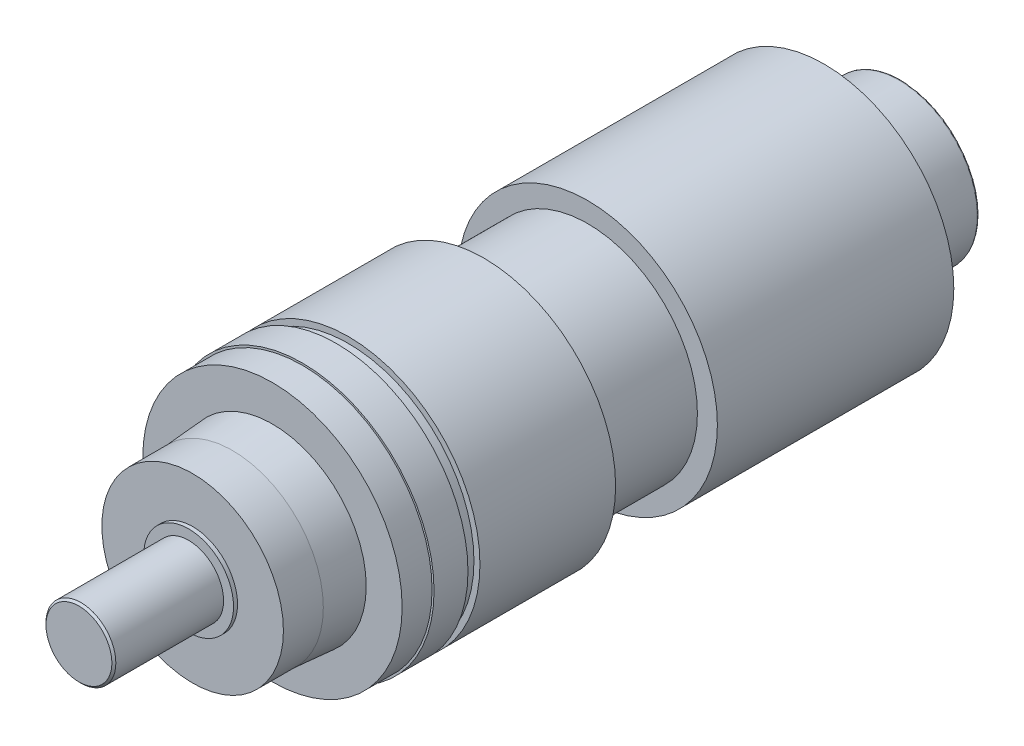
ISO-10303-21;
HEADER;
FILE_DESCRIPTION(('STEP AP214'),'2;1');
FILE_NAME('part.step','',(''),(''),'','','');
FILE_SCHEMA(('AUTOMOTIVE_DESIGN { 1 0 10303 214 1 1 1 1 }'));
ENDSEC;
DATA;
#1=APPLICATION_CONTEXT('core data for automotive mechanical design processes');
#2=APPLICATION_PROTOCOL_DEFINITION('international standard','automotive_design',2000,#1);
#3=PRODUCT_CONTEXT('',#1,'mechanical');
#4=PRODUCT('Part','Part','',(#3));
#5=PRODUCT_RELATED_PRODUCT_CATEGORY('part','',(#4));
#6=PRODUCT_DEFINITION_FORMATION('','',#4);
#7=PRODUCT_DEFINITION_CONTEXT('part definition',#1,'design');
#8=PRODUCT_DEFINITION('design','',#6,#7);
#9=PRODUCT_DEFINITION_SHAPE('','',#8);
#10=(LENGTH_UNIT() NAMED_UNIT(*) SI_UNIT(.MILLI.,.METRE.));
#11=(NAMED_UNIT(*) PLANE_ANGLE_UNIT() SI_UNIT($,.RADIAN.));
#12=(NAMED_UNIT(*) SI_UNIT($,.STERADIAN.) SOLID_ANGLE_UNIT());
#13=UNCERTAINTY_MEASURE_WITH_UNIT(LENGTH_MEASURE(1.E-05),#10,'distance_accuracy_value','');
#14=(GEOMETRIC_REPRESENTATION_CONTEXT(3) GLOBAL_UNCERTAINTY_ASSIGNED_CONTEXT((#13)) GLOBAL_UNIT_ASSIGNED_CONTEXT((#10,
#11,#12)) REPRESENTATION_CONTEXT('',''));
#15=CARTESIAN_POINT('',(0.,0.,0.));
#16=DIRECTION('',(0.,0.,1.));
#17=DIRECTION('',(1.,0.,0.));
#18=AXIS2_PLACEMENT_3D('',#15,#16,#17);
#19=CARTESIAN_POINT('',(0.,40.0334954681413,-331.5));
#20=DIRECTION('',(0.,0.,1.));
#21=DIRECTION('',(1.,0.,0.));
#22=AXIS2_PLACEMENT_3D('',#19,#20,#21);
#23=PLANE('',#22);
#24=CARTESIAN_POINT('',(0.,0.,-331.5));
#25=DIRECTION('',(0.,0.,1.));
#26=DIRECTION('',(1.,0.,0.));
#27=AXIS2_PLACEMENT_3D('',#24,#25,#26);
#28=CIRCLE('',#27,42.5000000000001);
#29=CARTESIAN_POINT('',(42.5000000000001,0.,-331.5));
#30=VERTEX_POINT('',#29);
#31=EDGE_CURVE('E50',#30,#30,#28,.T.);
#32=ORIENTED_EDGE('',*,*,#31,.F.);
#33=EDGE_LOOP('',(#32));
#34=FACE_BOUND('',#33,.T.);
#35=CARTESIAN_POINT('',(0.,0.,-331.5));
#36=DIRECTION('',(0.,0.,1.));
#37=DIRECTION('',(1.,0.,0.));
#38=AXIS2_PLACEMENT_3D('',#35,#36,#37);
#39=CIRCLE('',#38,40.0334954681413);
#40=CARTESIAN_POINT('',(40.0334954681413,0.,-331.5));
#41=VERTEX_POINT('',#40);
#42=EDGE_CURVE('E113',#41,#41,#39,.T.);
#43=ORIENTED_EDGE('',*,*,#42,.T.);
#44=EDGE_LOOP('',(#43));
#45=FACE_BOUND('',#44,.T.);
#46=ADVANCED_FACE('F30',(#34,#45),#23,.F.);
#47=CARTESIAN_POINT('',(0.,0.,61.7080027707133));
#48=DIRECTION('',(0.,0.,1.));
#49=DIRECTION('',(1.,0.,0.));
#50=AXIS2_PLACEMENT_3D('',#47,#48,#49);
#51=CYLINDRICAL_SURFACE('',#50,42.5000000000001);
#52=CARTESIAN_POINT('',(0.,0.,-318.5));
#53=DIRECTION('',(0.,0.,1.));
#54=DIRECTION('',(1.,0.,0.));
#55=AXIS2_PLACEMENT_3D('',#52,#53,#54);
#56=CIRCLE('',#55,42.5000000000001);
#57=CARTESIAN_POINT('',(42.5000000000001,0.,-318.5));
#58=VERTEX_POINT('',#57);
#59=EDGE_CURVE('E53',#58,#58,#56,.T.);
#60=ORIENTED_EDGE('',*,*,#59,.F.);
#61=EDGE_LOOP('',(#60));
#62=FACE_BOUND('',#61,.T.);
#63=ORIENTED_EDGE('',*,*,#31,.T.);
#64=EDGE_LOOP('',(#63));
#65=FACE_BOUND('',#64,.T.);
#66=ADVANCED_FACE('F133',(#62,#65),#51,.T.);
#67=CARTESIAN_POINT('',(0.,65.0000000000001,-318.5));
#68=DIRECTION('',(0.,0.,1.));
#69=DIRECTION('',(1.,0.,0.));
#70=AXIS2_PLACEMENT_3D('',#67,#68,#69);
#71=PLANE('',#70);
#72=CARTESIAN_POINT('',(0.,0.,-318.5));
#73=DIRECTION('',(0.,0.,1.));
#74=DIRECTION('',(1.,0.,0.));
#75=AXIS2_PLACEMENT_3D('',#72,#73,#74);
#76=CIRCLE('',#75,65.0000000000001);
#77=CARTESIAN_POINT('',(65.0000000000001,0.,-318.5));
#78=VERTEX_POINT('',#77);
#79=EDGE_CURVE('E56',#78,#78,#76,.T.);
#80=ORIENTED_EDGE('',*,*,#79,.F.);
#81=EDGE_LOOP('',(#80));
#82=FACE_BOUND('',#81,.T.);
#83=ORIENTED_EDGE('',*,*,#59,.T.);
#84=EDGE_LOOP('',(#83));
#85=FACE_BOUND('',#84,.T.);
#86=ADVANCED_FACE('F139',(#82,#85),#71,.F.);
#87=CARTESIAN_POINT('',(0.,0.,61.7080027707133));
#88=DIRECTION('',(0.,0.,1.));
#89=DIRECTION('',(1.,0.,0.));
#90=AXIS2_PLACEMENT_3D('',#87,#88,#89);
#91=CYLINDRICAL_SURFACE('',#90,65.0000000000001);
#92=CARTESIAN_POINT('',(0.,0.,-200.002907483874));
#93=DIRECTION('',(0.,0.,1.));
#94=DIRECTION('',(1.,0.,0.));
#95=AXIS2_PLACEMENT_3D('',#92,#93,#94);
#96=CIRCLE('',#95,65.0000000000001);
#97=CARTESIAN_POINT('',(65.0000000000001,0.,-200.002907483874));
#98=VERTEX_POINT('',#97);
#99=EDGE_CURVE('E59',#98,#98,#96,.T.);
#100=ORIENTED_EDGE('',*,*,#99,.F.);
#101=EDGE_LOOP('',(#100));
#102=FACE_BOUND('',#101,.T.);
#103=ORIENTED_EDGE('',*,*,#79,.T.);
#104=EDGE_LOOP('',(#103));
#105=FACE_BOUND('',#104,.T.);
#106=ADVANCED_FACE('F146',(#102,#105),#91,.T.);
#107=CARTESIAN_POINT('',(0.,65.0000000000001,-200.002907483874));
#108=DIRECTION('',(0.,0.,-1.));
#109=DIRECTION('',(-1.,0.,0.));
#110=AXIS2_PLACEMENT_3D('',#107,#108,#109);
#111=PLANE('',#110);
#112=CARTESIAN_POINT('',(0.,0.,-200.002907483874));
#113=DIRECTION('',(0.,0.,1.));
#114=DIRECTION('',(1.,0.,0.));
#115=AXIS2_PLACEMENT_3D('',#112,#113,#114);
#116=CIRCLE('',#115,55.0000000000001);
#117=CARTESIAN_POINT('',(55.0000000000001,0.,-200.002907483874));
#118=VERTEX_POINT('',#117);
#119=EDGE_CURVE('E62',#118,#118,#116,.T.);
#120=ORIENTED_EDGE('',*,*,#119,.F.);
#121=EDGE_LOOP('',(#120));
#122=FACE_BOUND('',#121,.T.);
#123=ORIENTED_EDGE('',*,*,#99,.T.);
#124=EDGE_LOOP('',(#123));
#125=FACE_BOUND('',#124,.T.);
#126=ADVANCED_FACE('F150',(#122,#125),#111,.F.);
#127=CARTESIAN_POINT('',(0.,0.,61.7080027707133));
#128=DIRECTION('',(0.,0.,1.));
#129=DIRECTION('',(1.,0.,0.));
#130=AXIS2_PLACEMENT_3D('',#127,#128,#129);
#131=CYLINDRICAL_SURFACE('',#130,55.0000000000001);
#132=CARTESIAN_POINT('',(0.,0.,-148.));
#133=DIRECTION('',(0.,0.,1.));
#134=DIRECTION('',(1.,0.,0.));
#135=AXIS2_PLACEMENT_3D('',#132,#133,#134);
#136=CIRCLE('',#135,55.0000000000001);
#137=CARTESIAN_POINT('',(55.0000000000001,0.,-148.));
#138=VERTEX_POINT('',#137);
#139=EDGE_CURVE('E65',#138,#138,#136,.T.);
#140=ORIENTED_EDGE('',*,*,#139,.F.);
#141=EDGE_LOOP('',(#140));
#142=FACE_BOUND('',#141,.T.);
#143=ORIENTED_EDGE('',*,*,#119,.T.);
#144=EDGE_LOOP('',(#143));
#145=FACE_BOUND('',#144,.T.);
#146=ADVANCED_FACE('F154',(#142,#145),#131,.T.);
#147=CARTESIAN_POINT('',(0.,55.0000000000001,-148.));
#148=DIRECTION('',(0.,0.,1.));
#149=DIRECTION('',(1.,0.,0.));
#150=AXIS2_PLACEMENT_3D('',#147,#148,#149);
#151=PLANE('',#150);
#152=CARTESIAN_POINT('',(0.,0.,-148.));
#153=DIRECTION('',(0.,0.,1.));
#154=DIRECTION('',(1.,0.,0.));
#155=AXIS2_PLACEMENT_3D('',#152,#153,#154);
#156=CIRCLE('',#155,66.);
#157=CARTESIAN_POINT('',(66.,0.,-148.));
#158=VERTEX_POINT('',#157);
#159=EDGE_CURVE('E68',#158,#158,#156,.T.);
#160=ORIENTED_EDGE('',*,*,#159,.F.);
#161=EDGE_LOOP('',(#160));
#162=FACE_BOUND('',#161,.T.);
#163=ORIENTED_EDGE('',*,*,#139,.T.);
#164=EDGE_LOOP('',(#163));
#165=FACE_BOUND('',#164,.T.);
#166=ADVANCED_FACE('F158',(#162,#165),#151,.F.);
#167=CARTESIAN_POINT('',(0.,0.,61.7080027707133));
#168=DIRECTION('',(0.,0.,1.));
#169=DIRECTION('',(1.,0.,0.));
#170=AXIS2_PLACEMENT_3D('',#167,#168,#169);
#171=CYLINDRICAL_SURFACE('',#170,66.);
#172=CARTESIAN_POINT('',(0.,0.,-80.));
#173=DIRECTION('',(0.,0.,1.));
#174=DIRECTION('',(1.,0.,0.));
#175=AXIS2_PLACEMENT_3D('',#172,#173,#174);
#176=CIRCLE('',#175,66.);
#177=CARTESIAN_POINT('',(66.,0.,-80.));
#178=VERTEX_POINT('',#177);
#179=EDGE_CURVE('E71',#178,#178,#176,.T.);
#180=ORIENTED_EDGE('',*,*,#179,.F.);
#181=EDGE_LOOP('',(#180));
#182=FACE_BOUND('',#181,.T.);
#183=ORIENTED_EDGE('',*,*,#159,.T.);
#184=EDGE_LOOP('',(#183));
#185=FACE_BOUND('',#184,.T.);
#186=ADVANCED_FACE('F162',(#182,#185),#171,.T.);
#187=CARTESIAN_POINT('',(0.,66.,-80.));
#188=DIRECTION('',(0.,0.,-1.));
#189=DIRECTION('',(-1.,0.,0.));
#190=AXIS2_PLACEMENT_3D('',#187,#188,#189);
#191=PLANE('',#190);
#192=CARTESIAN_POINT('',(0.,0.,-80.));
#193=DIRECTION('',(0.,0.,1.));
#194=DIRECTION('',(1.,0.,0.));
#195=AXIS2_PLACEMENT_3D('',#192,#193,#194);
#196=CIRCLE('',#195,63.);
#197=CARTESIAN_POINT('',(63.,0.,-80.));
#198=VERTEX_POINT('',#197);
#199=EDGE_CURVE('E74',#198,#198,#196,.T.);
#200=ORIENTED_EDGE('',*,*,#199,.F.);
#201=EDGE_LOOP('',(#200));
#202=FACE_BOUND('',#201,.T.);
#203=ORIENTED_EDGE('',*,*,#179,.T.);
#204=EDGE_LOOP('',(#203));
#205=FACE_BOUND('',#204,.T.);
#206=ADVANCED_FACE('F166',(#202,#205),#191,.F.);
#207=CARTESIAN_POINT('',(0.,0.,61.7080027707133));
#208=DIRECTION('',(0.,0.,1.));
#209=DIRECTION('',(1.,0.,0.));
#210=AXIS2_PLACEMENT_3D('',#207,#208,#209);
#211=CYLINDRICAL_SURFACE('',#210,63.);
#212=CARTESIAN_POINT('',(0.,0.,-74.));
#213=DIRECTION('',(0.,0.,1.));
#214=DIRECTION('',(1.,0.,0.));
#215=AXIS2_PLACEMENT_3D('',#212,#213,#214);
#216=CIRCLE('',#215,63.);
#217=CARTESIAN_POINT('',(63.,0.,-74.));
#218=VERTEX_POINT('',#217);
#219=EDGE_CURVE('E77',#218,#218,#216,.T.);
#220=ORIENTED_EDGE('',*,*,#219,.F.);
#221=EDGE_LOOP('',(#220));
#222=FACE_BOUND('',#221,.T.);
#223=ORIENTED_EDGE('',*,*,#199,.T.);
#224=EDGE_LOOP('',(#223));
#225=FACE_BOUND('',#224,.T.);
#226=ADVANCED_FACE('F170',(#222,#225),#211,.T.);
#227=CARTESIAN_POINT('',(0.,63.,-74.));
#228=DIRECTION('',(0.,0.,1.));
#229=DIRECTION('',(1.,0.,0.));
#230=AXIS2_PLACEMENT_3D('',#227,#228,#229);
#231=PLANE('',#230);
#232=CARTESIAN_POINT('',(0.,0.,-74.));
#233=DIRECTION('',(0.,0.,1.));
#234=DIRECTION('',(1.,0.,0.));
#235=AXIS2_PLACEMENT_3D('',#232,#233,#234);
#236=CIRCLE('',#235,66.);
#237=CARTESIAN_POINT('',(66.,0.,-74.));
#238=VERTEX_POINT('',#237);
#239=EDGE_CURVE('E80',#238,#238,#236,.T.);
#240=ORIENTED_EDGE('',*,*,#239,.F.);
#241=EDGE_LOOP('',(#240));
#242=FACE_BOUND('',#241,.T.);
#243=ORIENTED_EDGE('',*,*,#219,.T.);
#244=EDGE_LOOP('',(#243));
#245=FACE_BOUND('',#244,.T.);
#246=ADVANCED_FACE('F174',(#242,#245),#231,.F.);
#247=CARTESIAN_POINT('',(0.,0.,61.7080027707133));
#248=DIRECTION('',(0.,0.,1.));
#249=DIRECTION('',(1.,0.,0.));
#250=AXIS2_PLACEMENT_3D('',#247,#248,#249);
#251=CYLINDRICAL_SURFACE('',#250,66.);
#252=CARTESIAN_POINT('',(0.,0.,-57.));
#253=DIRECTION('',(0.,0.,1.));
#254=DIRECTION('',(1.,0.,0.));
#255=AXIS2_PLACEMENT_3D('',#252,#253,#254);
#256=CIRCLE('',#255,66.);
#257=CARTESIAN_POINT('',(66.,0.,-57.));
#258=VERTEX_POINT('',#257);
#259=EDGE_CURVE('E83',#258,#258,#256,.T.);
#260=ORIENTED_EDGE('',*,*,#259,.F.);
#261=EDGE_LOOP('',(#260));
#262=FACE_BOUND('',#261,.T.);
#263=ORIENTED_EDGE('',*,*,#239,.T.);
#264=EDGE_LOOP('',(#263));
#265=FACE_BOUND('',#264,.T.);
#266=ADVANCED_FACE('F178',(#262,#265),#251,.T.);
#267=CARTESIAN_POINT('',(0.,66.,-57.));
#268=DIRECTION('',(0.,0.,-1.));
#269=DIRECTION('',(-1.,0.,0.));
#270=AXIS2_PLACEMENT_3D('',#267,#268,#269);
#271=PLANE('',#270);
#272=CARTESIAN_POINT('',(0.,0.,-57.));
#273=DIRECTION('',(0.,0.,1.));
#274=DIRECTION('',(1.,0.,0.));
#275=AXIS2_PLACEMENT_3D('',#272,#273,#274);
#276=CIRCLE('',#275,65.);
#277=CARTESIAN_POINT('',(65.,0.,-57.));
#278=VERTEX_POINT('',#277);
#279=EDGE_CURVE('E86',#278,#278,#276,.T.);
#280=ORIENTED_EDGE('',*,*,#279,.F.);
#281=EDGE_LOOP('',(#280));
#282=FACE_BOUND('',#281,.T.);
#283=ORIENTED_EDGE('',*,*,#259,.T.);
#284=EDGE_LOOP('',(#283));
#285=FACE_BOUND('',#284,.T.);
#286=ADVANCED_FACE('F182',(#282,#285),#271,.F.);
#287=CARTESIAN_POINT('',(0.,0.,61.7080027707133));
#288=DIRECTION('',(0.,0.,1.));
#289=DIRECTION('',(1.,0.,0.));
#290=AXIS2_PLACEMENT_3D('',#287,#288,#289);
#291=CYLINDRICAL_SURFACE('',#290,64.9999999999998);
#292=CARTESIAN_POINT('',(0.,0.,-42.));
#293=DIRECTION('',(0.,0.,1.));
#294=DIRECTION('',(1.,0.,0.));
#295=AXIS2_PLACEMENT_3D('',#292,#293,#294);
#296=CIRCLE('',#295,64.9999999999997);
#297=CARTESIAN_POINT('',(64.9999999999997,0.,-42.));
#298=VERTEX_POINT('',#297);
#299=EDGE_CURVE('E89',#298,#298,#296,.T.);
#300=ORIENTED_EDGE('',*,*,#299,.F.);
#301=EDGE_LOOP('',(#300));
#302=FACE_BOUND('',#301,.T.);
#303=ORIENTED_EDGE('',*,*,#279,.T.);
#304=EDGE_LOOP('',(#303));
#305=FACE_BOUND('',#304,.T.);
#306=ADVANCED_FACE('F186',(#302,#305),#291,.T.);
#307=CARTESIAN_POINT('',(0.,47.,-42.));
#308=DIRECTION('',(0.,0.,-1.));
#309=DIRECTION('',(-1.,0.,0.));
#310=AXIS2_PLACEMENT_3D('',#307,#308,#309);
#311=PLANE('',#310);
#312=CARTESIAN_POINT('',(0.,0.,-42.));
#313=DIRECTION('',(0.,0.,1.));
#314=DIRECTION('',(1.,0.,0.));
#315=AXIS2_PLACEMENT_3D('',#312,#313,#314);
#316=CIRCLE('',#315,47.);
#317=CARTESIAN_POINT('',(47.,0.,-42.));
#318=VERTEX_POINT('',#317);
#319=EDGE_CURVE('E92',#318,#318,#316,.T.);
#320=ORIENTED_EDGE('',*,*,#319,.F.);
#321=EDGE_LOOP('',(#320));
#322=FACE_BOUND('',#321,.T.);
#323=ORIENTED_EDGE('',*,*,#299,.T.);
#324=EDGE_LOOP('',(#323));
#325=FACE_BOUND('',#324,.T.);
#326=ADVANCED_FACE('F190',(#322,#325),#311,.F.);
#327=CARTESIAN_POINT('',(0.,0.,-42.));
#328=DIRECTION('',(0.,0.,-1.));
#329=DIRECTION('',(-1.,0.,0.));
#330=AXIS2_PLACEMENT_3D('',#327,#328,#329);
#331=CONICAL_SURFACE('',#330,47.,0.0748598477107675);
#332=CARTESIAN_POINT('',(0.,0.,-22.));
#333=DIRECTION('',(0.,0.,1.));
#334=DIRECTION('',(1.,0.,0.));
#335=AXIS2_PLACEMENT_3D('',#332,#333,#334);
#336=CIRCLE('',#335,45.5);
#337=CARTESIAN_POINT('',(45.5,0.,-22.));
#338=VERTEX_POINT('',#337);
#339=EDGE_CURVE('E95',#338,#338,#336,.T.);
#340=ORIENTED_EDGE('',*,*,#339,.F.);
#341=EDGE_LOOP('',(#340));
#342=FACE_BOUND('',#341,.T.);
#343=ORIENTED_EDGE('',*,*,#319,.T.);
#344=EDGE_LOOP('',(#343));
#345=FACE_BOUND('',#344,.T.);
#346=ADVANCED_FACE('F194',(#342,#345),#331,.T.);
#347=CARTESIAN_POINT('',(0.,0.,61.7080027707133));
#348=DIRECTION('',(0.,0.,1.));
#349=DIRECTION('',(1.,0.,0.));
#350=AXIS2_PLACEMENT_3D('',#347,#348,#349);
#351=CYLINDRICAL_SURFACE('',#350,45.5);
#352=CARTESIAN_POINT('',(0.,0.,-2.00000000000046));
#353=DIRECTION('',(0.,0.,1.));
#354=DIRECTION('',(1.,0.,0.));
#355=AXIS2_PLACEMENT_3D('',#352,#353,#354);
#356=CIRCLE('',#355,45.5);
#357=CARTESIAN_POINT('',(45.5,0.,-2.00000000000046));
#358=VERTEX_POINT('',#357);
#359=EDGE_CURVE('E98',#358,#358,#356,.T.);
#360=ORIENTED_EDGE('',*,*,#359,.F.);
#361=EDGE_LOOP('',(#360));
#362=FACE_BOUND('',#361,.T.);
#363=ORIENTED_EDGE('',*,*,#339,.T.);
#364=EDGE_LOOP('',(#363));
#365=FACE_BOUND('',#364,.T.);
#366=ADVANCED_FACE('F198',(#362,#365),#351,.T.);
#367=CARTESIAN_POINT('',(0.,45.5,-2.00000000000046));
#368=DIRECTION('',(0.,0.,-1.));
#369=DIRECTION('',(-1.,0.,0.));
#370=AXIS2_PLACEMENT_3D('',#367,#368,#369);
#371=PLANE('',#370);
#372=CARTESIAN_POINT('',(0.,0.,-2.00000000000046));
#373=DIRECTION('',(0.,0.,1.));
#374=DIRECTION('',(1.,0.,0.));
#375=AXIS2_PLACEMENT_3D('',#372,#373,#374);
#376=CIRCLE('',#375,22.4999999999996);
#377=CARTESIAN_POINT('',(22.4999999999996,0.,-2.00000000000046));
#378=VERTEX_POINT('',#377);
#379=EDGE_CURVE('E101',#378,#378,#376,.T.);
#380=ORIENTED_EDGE('',*,*,#379,.F.);
#381=EDGE_LOOP('',(#380));
#382=FACE_BOUND('',#381,.T.);
#383=ORIENTED_EDGE('',*,*,#359,.T.);
#384=EDGE_LOOP('',(#383));
#385=FACE_BOUND('',#384,.T.);
#386=ADVANCED_FACE('F202',(#382,#385),#371,.F.);
#387=CARTESIAN_POINT('',(0.,0.,61.7080027707133));
#388=DIRECTION('',(0.,0.,1.));
#389=DIRECTION('',(1.,0.,0.));
#390=AXIS2_PLACEMENT_3D('',#387,#388,#389);
#391=CYLINDRICAL_SURFACE('',#390,22.4999999999996);
#392=CARTESIAN_POINT('',(0.,0.,0.));
#393=DIRECTION('',(0.,0.,1.));
#394=DIRECTION('',(1.,0.,0.));
#395=AXIS2_PLACEMENT_3D('',#392,#393,#394);
#396=CIRCLE('',#395,22.4999999999996);
#397=CARTESIAN_POINT('',(22.4999999999996,0.,0.));
#398=VERTEX_POINT('',#397);
#399=EDGE_CURVE('E104',#398,#398,#396,.T.);
#400=ORIENTED_EDGE('',*,*,#399,.F.);
#401=EDGE_LOOP('',(#400));
#402=FACE_BOUND('',#401,.T.);
#403=ORIENTED_EDGE('',*,*,#379,.T.);
#404=EDGE_LOOP('',(#403));
#405=FACE_BOUND('',#404,.T.);
#406=ADVANCED_FACE('F206',(#402,#405),#391,.T.);
#407=CARTESIAN_POINT('',(0.,22.4999999999996,0.));
#408=DIRECTION('',(0.,0.,-1.));
#409=DIRECTION('',(-1.,0.,0.));
#410=AXIS2_PLACEMENT_3D('',#407,#408,#409);
#411=PLANE('',#410);
#412=CARTESIAN_POINT('',(0.,0.,0.));
#413=DIRECTION('',(0.,0.,1.));
#414=DIRECTION('',(1.,0.,0.));
#415=AXIS2_PLACEMENT_3D('',#412,#413,#414);
#416=CIRCLE('',#415,17.4999999999993);
#417=CARTESIAN_POINT('',(17.4999999999993,0.,0.));
#418=VERTEX_POINT('',#417);
#419=EDGE_CURVE('E107',#418,#418,#416,.T.);
#420=ORIENTED_EDGE('',*,*,#419,.F.);
#421=EDGE_LOOP('',(#420));
#422=FACE_BOUND('',#421,.T.);
#423=ORIENTED_EDGE('',*,*,#399,.T.);
#424=EDGE_LOOP('',(#423));
#425=FACE_BOUND('',#424,.T.);
#426=ADVANCED_FACE('F210',(#422,#425),#411,.F.);
#427=CARTESIAN_POINT('',(0.,0.,61.7080027707133));
#428=DIRECTION('',(0.,0.,1.));
#429=DIRECTION('',(1.,0.,0.));
#430=AXIS2_PLACEMENT_3D('',#427,#428,#429);
#431=CYLINDRICAL_SURFACE('',#430,17.4999999999997);
#432=CARTESIAN_POINT('',(0.,0.,54.0000000000004));
#433=DIRECTION('',(0.,0.,-1.));
#434=DIRECTION('',(-1.,0.,0.));
#435=AXIS2_PLACEMENT_3D('',#432,#433,#434);
#436=CIRCLE('',#435,17.4999999999997);
#437=CARTESIAN_POINT('',(-17.4999999999997,0.,54.0000000000004));
#438=VERTEX_POINT('',#437);
#439=EDGE_CURVE('E10',#438,#438,#436,.T.);
#440=ORIENTED_EDGE('',*,*,#439,.T.);
#441=EDGE_LOOP('',(#440));
#442=FACE_BOUND('',#441,.T.);
#443=ORIENTED_EDGE('',*,*,#419,.T.);
#444=EDGE_LOOP('',(#443));
#445=FACE_BOUND('',#444,.T.);
#446=ADVANCED_FACE('F214',(#442,#445),#431,.T.);
#447=CARTESIAN_POINT('',(0.,17.5,55.));
#448=DIRECTION('',(0.,0.,-1.));
#449=DIRECTION('',(-1.,0.,0.));
#450=AXIS2_PLACEMENT_3D('',#447,#448,#449);
#451=PLANE('',#450);
#452=CARTESIAN_POINT('',(0.,0.,55.));
#453=DIRECTION('',(0.,0.,-1.));
#454=DIRECTION('',(-1.,0.,0.));
#455=AXIS2_PLACEMENT_3D('',#452,#453,#454);
#456=CIRCLE('',#455,16.5);
#457=CARTESIAN_POINT('',(-16.5,0.,55.));
#458=VERTEX_POINT('',#457);
#459=EDGE_CURVE('E37',#458,#458,#456,.F.);
#460=ORIENTED_EDGE('',*,*,#459,.T.);
#461=EDGE_LOOP('',(#460));
#462=FACE_BOUND('',#461,.T.);
#463=ADVANCED_FACE('F218',(#462),#451,.F.);
#464=CARTESIAN_POINT('',(0.,30.7500000000002,-358.));
#465=DIRECTION('',(0.,0.,1.));
#466=DIRECTION('',(1.,0.,0.));
#467=AXIS2_PLACEMENT_3D('',#464,#465,#466);
#468=PLANE('',#467);
#469=CARTESIAN_POINT('',(0.,0.,-358.));
#470=DIRECTION('',(0.,0.,1.));
#471=DIRECTION('',(1.,0.,0.));
#472=AXIS2_PLACEMENT_3D('',#469,#470,#471);
#473=CIRCLE('',#472,30.7500000000002);
#474=CARTESIAN_POINT('',(30.7500000000002,0.,-358.));
#475=VERTEX_POINT('',#474);
#476=EDGE_CURVE('E110',#475,#475,#473,.T.);
#477=ORIENTED_EDGE('',*,*,#476,.F.);
#478=EDGE_LOOP('',(#477));
#479=FACE_BOUND('',#478,.T.);
#480=ADVANCED_FACE('F129',(#479),#468,.F.);
#481=CARTESIAN_POINT('',(0.,0.,-328.));
#482=DIRECTION('',(0.,0.,1.));
#483=DIRECTION('',(1.,0.,0.));
#484=AXIS2_PLACEMENT_3D('',#481,#482,#483);
#485=TOROIDAL_SURFACE('',#484,30.7500000000002,30.);
#486=CARTESIAN_POINT('',(0.,0.,-356.999708072895));
#487=DIRECTION('',(0.,0.,1.));
#488=DIRECTION('',(1.,0.,0.));
#489=AXIS2_PLACEMENT_3D('',#486,#487,#488);
#490=CIRCLE('',#489,38.432247827745);
#491=CARTESIAN_POINT('',(38.432247827745,0.,-356.999708072895));
#492=VERTEX_POINT('',#491);
#493=EDGE_CURVE('E41',#492,#492,#490,.F.);
#494=ORIENTED_EDGE('',*,*,#493,.T.);
#495=EDGE_LOOP('',(#494));
#496=FACE_BOUND('',#495,.T.);
#497=ORIENTED_EDGE('',*,*,#476,.T.);
#498=EDGE_LOOP('',(#497));
#499=FACE_BOUND('',#498,.T.);
#500=ADVANCED_FACE('F121',(#496,#499),#485,.T.);
#501=CARTESIAN_POINT('',(0.,0.,-356.8));
#502=DIRECTION('',(0.,0.,1.));
#503=DIRECTION('',(1.,0.,0.));
#504=AXIS2_PLACEMENT_3D('',#501,#502,#503);
#505=CONICAL_SURFACE('',#504,39.1500000000001,0.0349065850398866);
#506=CARTESIAN_POINT('',(0.,0.,-356.067950633834));
#507=DIRECTION('',(0.,0.,-1.));
#508=DIRECTION('',(-1.,0.,0.));
#509=AXIS2_PLACEMENT_3D('',#506,#507,#508);
#510=CIRCLE('',#509,39.1755637271726);
#511=CARTESIAN_POINT('',(-39.1755637271726,0.,-356.067950633834));
#512=VERTEX_POINT('',#511);
#513=EDGE_CURVE('E45',#512,#512,#510,.F.);
#514=ORIENTED_EDGE('',*,*,#513,.T.);
#515=EDGE_LOOP('',(#514));
#516=FACE_BOUND('',#515,.T.);
#517=ORIENTED_EDGE('',*,*,#42,.F.);
#518=EDGE_LOOP('',(#517));
#519=FACE_BOUND('',#518,.T.);
#520=ADVANCED_FACE('F118',(#516,#519),#505,.T.);
#521=CARTESIAN_POINT('',(0.,0.,-356.033051137131));
#522=DIRECTION('',(0.,0.,-1.));
#523=DIRECTION('',(-1.,0.,0.));
#524=AXIS2_PLACEMENT_3D('',#521,#522,#523);
#525=TOROIDAL_SURFACE('',#524,38.1761729001535,1.);
#526=ORIENTED_EDGE('',*,*,#493,.F.);
#527=EDGE_LOOP('',(#526));
#528=FACE_BOUND('',#527,.T.);
#529=ORIENTED_EDGE('',*,*,#513,.F.);
#530=EDGE_LOOP('',(#529));
#531=FACE_BOUND('',#530,.T.);
#532=ADVANCED_FACE('F120',(#528,#531),#525,.T.);
#533=CARTESIAN_POINT('',(0.,0.,55.));
#534=DIRECTION('',(0.,0.,-1.));
#535=DIRECTION('',(-1.,0.,0.));
#536=AXIS2_PLACEMENT_3D('',#533,#534,#535);
#537=CONICAL_SURFACE('',#536,16.5,0.78539816339745);
#538=ORIENTED_EDGE('',*,*,#439,.F.);
#539=EDGE_LOOP('',(#538));
#540=FACE_BOUND('',#539,.T.);
#541=ORIENTED_EDGE('',*,*,#459,.F.);
#542=EDGE_LOOP('',(#541));
#543=FACE_BOUND('',#542,.T.);
#544=ADVANCED_FACE('F32',(#540,#543),#537,.T.);
#545=CLOSED_SHELL('',(#46,#66,#86,#106,#126,#146,#166,#186,#206,#226,#246,#266,#286,#306,#326,
#346,#366,#386,#406,#426,#446,#463,#480,#500,#520,#532,#544));
#546=MANIFOLD_SOLID_BREP('B2',#545);
#547=ADVANCED_BREP_SHAPE_REPRESENTATION('',(#18,#546),#14);
#548=SHAPE_DEFINITION_REPRESENTATION(#9,#547);
ENDSEC;
END-ISO-10303-21;
